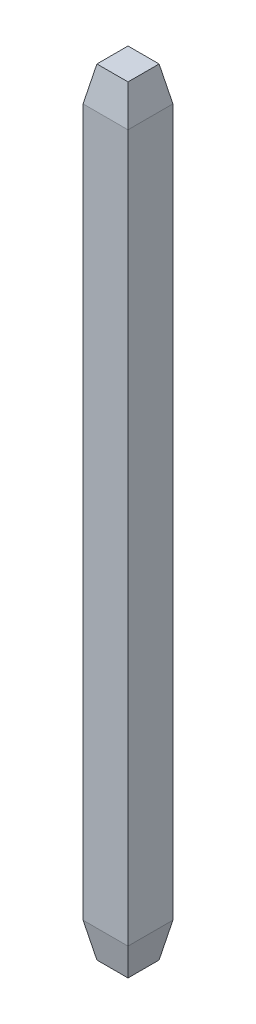
ISO-10303-21;
HEADER;
FILE_DESCRIPTION(('STEP AP214'),'2;1');
FILE_NAME('part.step','',(''),(''),'','','');
FILE_SCHEMA(('AUTOMOTIVE_DESIGN { 1 0 10303 214 1 1 1 1 }'));
ENDSEC;
DATA;
#1=APPLICATION_CONTEXT('core data for automotive mechanical design processes');
#2=APPLICATION_PROTOCOL_DEFINITION('international standard','automotive_design',2000,#1);
#3=PRODUCT_CONTEXT('',#1,'mechanical');
#4=PRODUCT('Part','Part','',(#3));
#5=PRODUCT_RELATED_PRODUCT_CATEGORY('part','',(#4));
#6=PRODUCT_DEFINITION_FORMATION('','',#4);
#7=PRODUCT_DEFINITION_CONTEXT('part definition',#1,'design');
#8=PRODUCT_DEFINITION('design','',#6,#7);
#9=PRODUCT_DEFINITION_SHAPE('','',#8);
#10=(LENGTH_UNIT() NAMED_UNIT(*) SI_UNIT(.MILLI.,.METRE.));
#11=(NAMED_UNIT(*) PLANE_ANGLE_UNIT() SI_UNIT($,.RADIAN.));
#12=(NAMED_UNIT(*) SI_UNIT($,.STERADIAN.) SOLID_ANGLE_UNIT());
#13=UNCERTAINTY_MEASURE_WITH_UNIT(LENGTH_MEASURE(1.E-05),#10,'distance_accuracy_value','');
#14=(GEOMETRIC_REPRESENTATION_CONTEXT(3) GLOBAL_UNCERTAINTY_ASSIGNED_CONTEXT((#13)) GLOBAL_UNIT_ASSIGNED_CONTEXT((#10,
#11,#12)) REPRESENTATION_CONTEXT('',''));
#15=CARTESIAN_POINT('',(0.,0.,0.));
#16=DIRECTION('',(0.,0.,1.));
#17=DIRECTION('',(1.,0.,0.));
#18=AXIS2_PLACEMENT_3D('',#15,#16,#17);
#19=CARTESIAN_POINT('',(14.078422880533,-2.665,9.068168035309));
#20=DIRECTION('',(0.,0.,1.));
#21=DIRECTION('',(1.,0.,0.));
#22=AXIS2_PLACEMENT_3D('',#19,#20,#21);
#23=PLANE('',#22);
#24=DIRECTION('',(-1.,0.,0.));
#25=VECTOR('',#24,1.);
#26=CARTESIAN_POINT('',(14.240922880533,2.45,9.068168035309));
#27=LINE('',#26,#25);
#28=CARTESIAN_POINT('',(14.403422880533,2.45,9.068168035309));
#29=VERTEX_POINT('',#28);
#30=CARTESIAN_POINT('',(13.753422880533,2.45,9.068168035309));
#31=VERTEX_POINT('',#30);
#32=EDGE_CURVE('E112',#29,#31,#27,.T.);
#33=ORIENTED_EDGE('',*,*,#32,.F.);
#34=DIRECTION('',(0.,1.,0.));
#35=VECTOR('',#34,1.);
#36=CARTESIAN_POINT('',(14.403422880533,-8.28,9.068168035309));
#37=LINE('',#36,#35);
#38=CARTESIAN_POINT('',(14.403422880533,-7.78,9.068168035309));
#39=VERTEX_POINT('',#38);
#40=EDGE_CURVE('E152',#39,#29,#37,.T.);
#41=ORIENTED_EDGE('',*,*,#40,.F.);
#42=DIRECTION('',(1.,0.,0.));
#43=VECTOR('',#42,1.);
#44=CARTESIAN_POINT('',(13.915922880533,-7.78,9.068168035309));
#45=LINE('',#44,#43);
#46=CARTESIAN_POINT('',(13.753422880533,-7.78,9.068168035309));
#47=VERTEX_POINT('',#46);
#48=EDGE_CURVE('E176',#47,#39,#45,.T.);
#49=ORIENTED_EDGE('',*,*,#48,.F.);
#50=DIRECTION('',(0.,-1.,0.));
#51=VECTOR('',#50,1.);
#52=CARTESIAN_POINT('',(13.753422880533,2.95,9.068168035309));
#53=LINE('',#52,#51);
#54=EDGE_CURVE('E201',#31,#47,#53,.T.);
#55=ORIENTED_EDGE('',*,*,#54,.F.);
#56=EDGE_LOOP('',(#33,#41,#49,#55));
#57=FACE_BOUND('',#56,.T.);
#58=ADVANCED_FACE('F17',(#57),#23,.F.);
#59=CARTESIAN_POINT('',(13.915922880533,-8.03,9.668168035309));
#60=DIRECTION('',(0.,-0.196116135137992,0.980580675690959));
#61=DIRECTION('',(-1.,0.,0.));
#62=AXIS2_PLACEMENT_3D('',#59,#60,#61);
#63=PLANE('',#62);
#64=DIRECTION('',(-0.192450089730061,0.962250448649302,0.192450089730061));
#65=VECTOR('',#64,1.);
#66=CARTESIAN_POINT('',(13.816617324978,-8.095972222222,9.654973590864));
#67=LINE('',#66,#65);
#68=CARTESIAN_POINT('',(13.853422880533,-8.28,9.618168035309));
#69=VERTEX_POINT('',#68);
#70=CARTESIAN_POINT('',(13.753422880533,-7.78,9.718168035309));
#71=VERTEX_POINT('',#70);
#72=EDGE_CURVE('E92',#69,#71,#67,.T.);
#73=ORIENTED_EDGE('',*,*,#72,.F.);
#74=DIRECTION('',(1.,0.,0.));
#75=VECTOR('',#74,1.);
#76=CARTESIAN_POINT('',(13.915922880533,-8.28,9.618168035309));
#77=LINE('',#76,#75);
#78=CARTESIAN_POINT('',(14.303422880533,-8.28,9.618168035309));
#79=VERTEX_POINT('',#78);
#80=EDGE_CURVE('E174',#69,#79,#77,.T.);
#81=ORIENTED_EDGE('',*,*,#80,.T.);
#82=DIRECTION('',(-0.192450089730061,-0.962250448649302,-0.192450089730061));
#83=VECTOR('',#82,1.);
#84=CARTESIAN_POINT('',(14.33420991757,-8.126064814815,9.648955072346));
#85=LINE('',#84,#83);
#86=CARTESIAN_POINT('',(14.403422880533,-7.78,9.718168035309));
#87=VERTEX_POINT('',#86);
#88=EDGE_CURVE('E11',#87,#79,#85,.T.);
#89=ORIENTED_EDGE('',*,*,#88,.F.);
#90=DIRECTION('',(-1.,0.,0.));
#91=VECTOR('',#90,1.);
#92=CARTESIAN_POINT('',(13.915922880533,-7.78,9.718168035309));
#93=LINE('',#92,#91);
#94=EDGE_CURVE('E155',#87,#71,#93,.T.);
#95=ORIENTED_EDGE('',*,*,#94,.T.);
#96=EDGE_LOOP('',(#73,#81,#89,#95));
#97=FACE_BOUND('',#96,.T.);
#98=ADVANCED_FACE('F359',(#97),#63,.T.);
#99=CARTESIAN_POINT('',(14.353422880533,-8.03,9.068168035309));
#100=DIRECTION('',(0.980580675690959,-0.196116135137992,0.));
#101=DIRECTION('',(0.,0.,-1.));
#102=AXIS2_PLACEMENT_3D('',#99,#100,#101);
#103=PLANE('',#102);
#104=DIRECTION('',(-0.192450089730061,-0.962250448649302,0.192450089730061));
#105=VECTOR('',#104,1.);
#106=CARTESIAN_POINT('',(14.346246954607,-8.06587962963,9.125343961235));
#107=LINE('',#106,#105);
#108=CARTESIAN_POINT('',(14.303422880533,-8.28,9.168168035309));
#109=VERTEX_POINT('',#108);
#110=EDGE_CURVE('E20',#39,#109,#107,.T.);
#111=ORIENTED_EDGE('',*,*,#110,.F.);
#112=DIRECTION('',(0.,0.,1.));
#113=VECTOR('',#112,1.);
#114=CARTESIAN_POINT('',(14.403422880533,-7.78,9.068168035309));
#115=LINE('',#114,#113);
#116=EDGE_CURVE('E149',#39,#87,#115,.T.);
#117=ORIENTED_EDGE('',*,*,#116,.T.);
#118=ORIENTED_EDGE('',*,*,#88,.T.);
#119=DIRECTION('',(0.,0.,-1.));
#120=VECTOR('',#119,1.);
#121=CARTESIAN_POINT('',(14.303422880533,-8.28,9.068168035309));
#122=LINE('',#121,#120);
#123=EDGE_CURVE('E171',#79,#109,#122,.T.);
#124=ORIENTED_EDGE('',*,*,#123,.T.);
#125=EDGE_LOOP('',(#111,#117,#118,#124));
#126=FACE_BOUND('',#125,.T.);
#127=ADVANCED_FACE('F190',(#126),#103,.T.);
#128=CARTESIAN_POINT('',(13.915922880533,-8.03,9.118168035309));
#129=DIRECTION('',(0.,-0.196116135137992,-0.980580675690959));
#130=DIRECTION('',(0.,-0.980580675690959,0.196116135137992));
#131=AXIS2_PLACEMENT_3D('',#128,#129,#130);
#132=PLANE('',#131);
#133=DIRECTION('',(0.192450089730061,-0.962250448649302,0.192450089730061));
#134=VECTOR('',#133,1.);
#135=CARTESIAN_POINT('',(13.804580287941,-8.035787037037,9.119325442716));
#136=LINE('',#135,#134);
#137=CARTESIAN_POINT('',(13.853422880533,-8.28,9.168168035309));
#138=VERTEX_POINT('',#137);
#139=EDGE_CURVE('E160',#47,#138,#136,.T.);
#140=ORIENTED_EDGE('',*,*,#139,.F.);
#141=ORIENTED_EDGE('',*,*,#48,.T.);
#142=ORIENTED_EDGE('',*,*,#110,.T.);
#143=DIRECTION('',(-1.,0.,0.));
#144=VECTOR('',#143,1.);
#145=CARTESIAN_POINT('',(13.915922880533,-8.28,9.168168035309));
#146=LINE('',#145,#144);
#147=EDGE_CURVE('E167',#109,#138,#146,.T.);
#148=ORIENTED_EDGE('',*,*,#147,.T.);
#149=EDGE_LOOP('',(#140,#141,#142,#148));
#150=FACE_BOUND('',#149,.T.);
#151=ADVANCED_FACE('F186',(#150),#132,.T.);
#152=CARTESIAN_POINT('',(13.753422880533,-8.28,9.068168035309));
#153=DIRECTION('',(0.,-1.,0.));
#154=DIRECTION('',(0.,0.,-1.));
#155=AXIS2_PLACEMENT_3D('',#152,#153,#154);
#156=PLANE('',#155);
#157=DIRECTION('',(0.,0.,1.));
#158=VECTOR('',#157,1.);
#159=CARTESIAN_POINT('',(13.853422880533,-8.28,9.068168035309));
#160=LINE('',#159,#158);
#161=EDGE_CURVE('E164',#138,#69,#160,.T.);
#162=ORIENTED_EDGE('',*,*,#161,.F.);
#163=ORIENTED_EDGE('',*,*,#147,.F.);
#164=ORIENTED_EDGE('',*,*,#123,.F.);
#165=ORIENTED_EDGE('',*,*,#80,.F.);
#166=EDGE_LOOP('',(#162,#163,#164,#165));
#167=FACE_BOUND('',#166,.T.);
#168=ADVANCED_FACE('F192',(#167),#156,.T.);
#169=CARTESIAN_POINT('',(13.803422880533,-8.03,9.068168035309));
#170=DIRECTION('',(-0.980580675690959,-0.196116135137992,0.));
#171=DIRECTION('',(-0.196116135137992,0.980580675690959,0.));
#172=AXIS2_PLACEMENT_3D('',#169,#170,#171);
#173=PLANE('',#172);
#174=ORIENTED_EDGE('',*,*,#72,.T.);
#175=DIRECTION('',(0.,0.,-1.));
#176=VECTOR('',#175,1.);
#177=CARTESIAN_POINT('',(13.753422880533,-7.78,9.068168035309));
#178=LINE('',#177,#176);
#179=EDGE_CURVE('E136',#71,#47,#178,.T.);
#180=ORIENTED_EDGE('',*,*,#179,.T.);
#181=ORIENTED_EDGE('',*,*,#139,.T.);
#182=ORIENTED_EDGE('',*,*,#161,.T.);
#183=EDGE_LOOP('',(#174,#180,#181,#182));
#184=FACE_BOUND('',#183,.T.);
#185=ADVANCED_FACE('F195',(#184),#173,.T.);
#186=CARTESIAN_POINT('',(14.078422880533,-2.665,9.718168035309));
#187=DIRECTION('',(0.,0.,1.));
#188=DIRECTION('',(1.,0.,0.));
#189=AXIS2_PLACEMENT_3D('',#186,#187,#188);
#190=PLANE('',#189);
#191=DIRECTION('',(1.,0.,0.));
#192=VECTOR('',#191,1.);
#193=CARTESIAN_POINT('',(14.240922880533,2.45,9.718168035309));
#194=LINE('',#193,#192);
#195=CARTESIAN_POINT('',(13.753422880533,2.45,9.718168035309));
#196=VERTEX_POINT('',#195);
#197=CARTESIAN_POINT('',(14.403422880533,2.45,9.718168035309));
#198=VERTEX_POINT('',#197);
#199=EDGE_CURVE('E143',#196,#198,#194,.T.);
#200=ORIENTED_EDGE('',*,*,#199,.F.);
#201=DIRECTION('',(0.,-1.,0.));
#202=VECTOR('',#201,1.);
#203=CARTESIAN_POINT('',(13.753422880533,2.95,9.718168035309));
#204=LINE('',#203,#202);
#205=EDGE_CURVE('E129',#196,#71,#204,.T.);
#206=ORIENTED_EDGE('',*,*,#205,.T.);
#207=ORIENTED_EDGE('',*,*,#94,.F.);
#208=DIRECTION('',(0.,1.,0.));
#209=VECTOR('',#208,1.);
#210=CARTESIAN_POINT('',(14.403422880533,-8.28,9.718168035309));
#211=LINE('',#210,#209);
#212=EDGE_CURVE('E148',#87,#198,#211,.T.);
#213=ORIENTED_EDGE('',*,*,#212,.T.);
#214=EDGE_LOOP('',(#200,#206,#207,#213));
#215=FACE_BOUND('',#214,.T.);
#216=ADVANCED_FACE('F244',(#215),#190,.T.);
#217=CARTESIAN_POINT('',(14.403422880533,-8.28,9.068168035309));
#218=DIRECTION('',(1.,0.,0.));
#219=DIRECTION('',(0.,0.,1.));
#220=AXIS2_PLACEMENT_3D('',#217,#218,#219);
#221=PLANE('',#220);
#222=DIRECTION('',(0.,0.,-1.));
#223=VECTOR('',#222,1.);
#224=CARTESIAN_POINT('',(14.403422880533,2.45,9.068168035309));
#225=LINE('',#224,#223);
#226=EDGE_CURVE('E119',#198,#29,#225,.T.);
#227=ORIENTED_EDGE('',*,*,#226,.F.);
#228=ORIENTED_EDGE('',*,*,#212,.F.);
#229=ORIENTED_EDGE('',*,*,#116,.F.);
#230=ORIENTED_EDGE('',*,*,#40,.T.);
#231=EDGE_LOOP('',(#227,#228,#229,#230));
#232=FACE_BOUND('',#231,.T.);
#233=ADVANCED_FACE('F248',(#232),#221,.T.);
#234=CARTESIAN_POINT('',(14.240922880533,2.7,9.668168035309));
#235=DIRECTION('',(0.,0.196116135137992,0.980580675690959));
#236=DIRECTION('',(1.,0.,0.));
#237=AXIS2_PLACEMENT_3D('',#234,#235,#236);
#238=PLANE('',#237);
#239=DIRECTION('',(0.192450089730061,0.962250448649302,-0.192450089730061));
#240=VECTOR('',#239,1.);
#241=CARTESIAN_POINT('',(13.822635843496,2.796064814815,9.648955072346));
#242=LINE('',#241,#240);
#243=CARTESIAN_POINT('',(13.853422880533,2.95,9.618168035309));
#244=VERTEX_POINT('',#243);
#245=EDGE_CURVE('E225',#196,#244,#242,.T.);
#246=ORIENTED_EDGE('',*,*,#245,.F.);
#247=ORIENTED_EDGE('',*,*,#199,.T.);
#248=DIRECTION('',(-0.192450089730061,0.962250448649302,-0.192450089730061));
#249=VECTOR('',#248,1.);
#250=CARTESIAN_POINT('',(14.340228436089,2.765972222222,9.654973590864));
#251=LINE('',#250,#249);
#252=CARTESIAN_POINT('',(14.303422880533,2.95,9.618168035309));
#253=VERTEX_POINT('',#252);
#254=EDGE_CURVE('E111',#198,#253,#251,.T.);
#255=ORIENTED_EDGE('',*,*,#254,.T.);
#256=DIRECTION('',(-1.,0.,0.));
#257=VECTOR('',#256,1.);
#258=CARTESIAN_POINT('',(14.240922880533,2.95,9.618168035309));
#259=LINE('',#258,#257);
#260=EDGE_CURVE('E106',#253,#244,#259,.T.);
#261=ORIENTED_EDGE('',*,*,#260,.T.);
#262=EDGE_LOOP('',(#246,#247,#255,#261));
#263=FACE_BOUND('',#262,.T.);
#264=ADVANCED_FACE('F237',(#263),#238,.T.);
#265=CARTESIAN_POINT('',(14.403422880533,2.95,9.068168035309));
#266=DIRECTION('',(0.,1.,0.));
#267=DIRECTION('',(1.,0.,0.));
#268=AXIS2_PLACEMENT_3D('',#265,#266,#267);
#269=PLANE('',#268);
#270=DIRECTION('',(0.,0.,-1.));
#271=VECTOR('',#270,1.);
#272=CARTESIAN_POINT('',(13.853422880533,2.95,9.068168035309));
#273=LINE('',#272,#271);
#274=CARTESIAN_POINT('',(13.853422880533,2.95,9.168168035309));
#275=VERTEX_POINT('',#274);
#276=EDGE_CURVE('E219',#244,#275,#273,.T.);
#277=ORIENTED_EDGE('',*,*,#276,.F.);
#278=ORIENTED_EDGE('',*,*,#260,.F.);
#279=DIRECTION('',(0.,0.,1.));
#280=VECTOR('',#279,1.);
#281=CARTESIAN_POINT('',(14.303422880533,2.95,9.068168035309));
#282=LINE('',#281,#280);
#283=CARTESIAN_POINT('',(14.303422880533,2.95,9.168168035309));
#284=VERTEX_POINT('',#283);
#285=EDGE_CURVE('E98',#284,#253,#282,.T.);
#286=ORIENTED_EDGE('',*,*,#285,.F.);
#287=DIRECTION('',(1.,0.,0.));
#288=VECTOR('',#287,1.);
#289=CARTESIAN_POINT('',(14.240922880533,2.95,9.168168035309));
#290=LINE('',#289,#288);
#291=EDGE_CURVE('E103',#275,#284,#290,.T.);
#292=ORIENTED_EDGE('',*,*,#291,.F.);
#293=EDGE_LOOP('',(#277,#278,#286,#292));
#294=FACE_BOUND('',#293,.T.);
#295=ADVANCED_FACE('F101',(#294),#269,.T.);
#296=CARTESIAN_POINT('',(14.353422880533,2.7,9.068168035309));
#297=DIRECTION('',(0.980580675690959,0.196116135137992,0.));
#298=DIRECTION('',(0.,0.,-1.));
#299=AXIS2_PLACEMENT_3D('',#296,#297,#298);
#300=PLANE('',#299);
#301=DIRECTION('',(0.192450089730061,-0.962250448649302,-0.192450089730061));
#302=VECTOR('',#301,1.);
#303=CARTESIAN_POINT('',(14.352265473126,2.705787037037,9.119325442716));
#304=LINE('',#303,#302);
#305=EDGE_CURVE('E116',#284,#29,#304,.T.);
#306=ORIENTED_EDGE('',*,*,#305,.F.);
#307=ORIENTED_EDGE('',*,*,#285,.T.);
#308=ORIENTED_EDGE('',*,*,#254,.F.);
#309=ORIENTED_EDGE('',*,*,#226,.T.);
#310=EDGE_LOOP('',(#306,#307,#308,#309));
#311=FACE_BOUND('',#310,.T.);
#312=ADVANCED_FACE('F117',(#311),#300,.T.);
#313=CARTESIAN_POINT('',(14.240922880533,2.7,9.118168035309));
#314=DIRECTION('',(0.,0.196116135137992,-0.980580675690959));
#315=DIRECTION('',(-1.,0.,0.));
#316=AXIS2_PLACEMENT_3D('',#313,#314,#315);
#317=PLANE('',#316);
#318=DIRECTION('',(-0.192450089730061,-0.962250448649302,-0.192450089730061));
#319=VECTOR('',#318,1.);
#320=CARTESIAN_POINT('',(13.810598806459,2.73587962963,9.125343961235));
#321=LINE('',#320,#319);
#322=EDGE_CURVE('E126',#275,#31,#321,.T.);
#323=ORIENTED_EDGE('',*,*,#322,.F.);
#324=ORIENTED_EDGE('',*,*,#291,.T.);
#325=ORIENTED_EDGE('',*,*,#305,.T.);
#326=ORIENTED_EDGE('',*,*,#32,.T.);
#327=EDGE_LOOP('',(#323,#324,#325,#326));
#328=FACE_BOUND('',#327,.T.);
#329=ADVANCED_FACE('F124',(#328),#317,.T.);
#330=CARTESIAN_POINT('',(13.753422880533,2.95,9.068168035309));
#331=DIRECTION('',(-1.,0.,0.));
#332=DIRECTION('',(0.,0.,1.));
#333=AXIS2_PLACEMENT_3D('',#330,#331,#332);
#334=PLANE('',#333);
#335=DIRECTION('',(0.,0.,1.));
#336=VECTOR('',#335,1.);
#337=CARTESIAN_POINT('',(13.753422880533,2.45,9.068168035309));
#338=LINE('',#337,#336);
#339=EDGE_CURVE('E207',#31,#196,#338,.T.);
#340=ORIENTED_EDGE('',*,*,#339,.F.);
#341=ORIENTED_EDGE('',*,*,#54,.T.);
#342=ORIENTED_EDGE('',*,*,#179,.F.);
#343=ORIENTED_EDGE('',*,*,#205,.F.);
#344=EDGE_LOOP('',(#340,#341,#342,#343));
#345=FACE_BOUND('',#344,.T.);
#346=ADVANCED_FACE('F205',(#345),#334,.T.);
#347=CARTESIAN_POINT('',(13.803422880533,2.7,9.068168035309));
#348=DIRECTION('',(-0.980580675690959,0.196116135137992,0.));
#349=DIRECTION('',(0.,0.,1.));
#350=AXIS2_PLACEMENT_3D('',#347,#348,#349);
#351=PLANE('',#350);
#352=ORIENTED_EDGE('',*,*,#245,.T.);
#353=ORIENTED_EDGE('',*,*,#276,.T.);
#354=ORIENTED_EDGE('',*,*,#322,.T.);
#355=ORIENTED_EDGE('',*,*,#339,.T.);
#356=EDGE_LOOP('',(#352,#353,#354,#355));
#357=FACE_BOUND('',#356,.T.);
#358=ADVANCED_FACE('F233',(#357),#351,.T.);
#359=CLOSED_SHELL('',(#58,#98,#127,#151,#168,#185,#216,#233,#264,#295,#312,#329,#346,#358));
#360=MANIFOLD_SOLID_BREP('B1',#359);
#361=ADVANCED_BREP_SHAPE_REPRESENTATION('',(#18,#360),#14);
#362=SHAPE_DEFINITION_REPRESENTATION(#9,#361);
ENDSEC;
END-ISO-10303-21;
